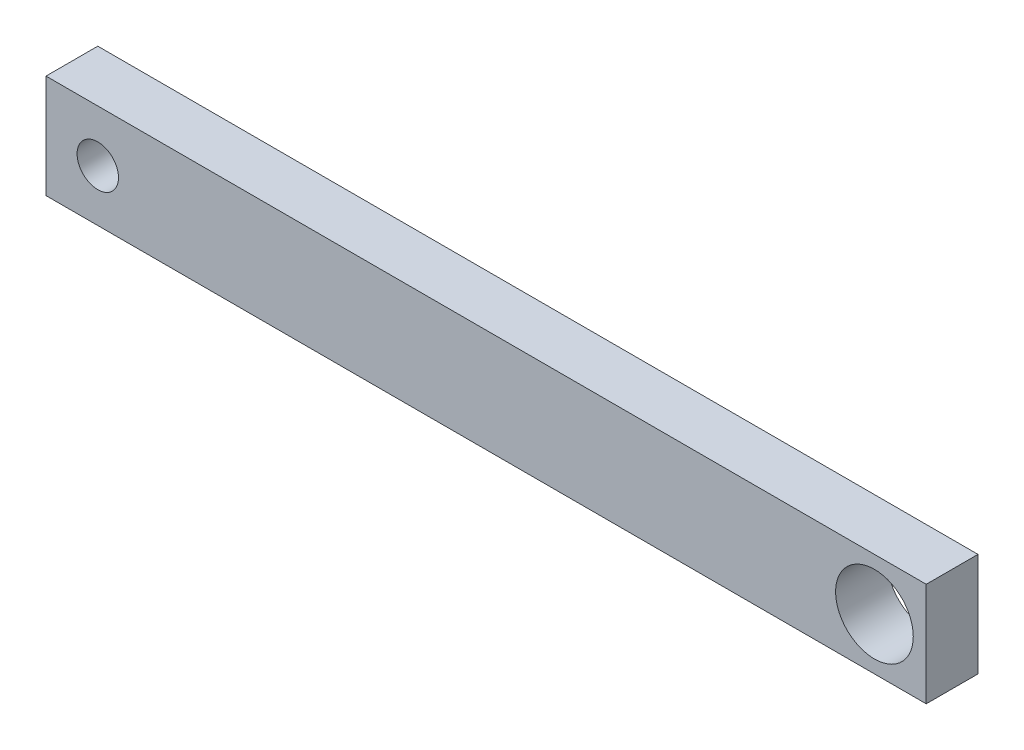
ISO-10303-21;
HEADER;
FILE_DESCRIPTION(('STEP AP214'),'2;1');
FILE_NAME('part.step','',(''),(''),'','','');
FILE_SCHEMA(('AUTOMOTIVE_DESIGN { 1 0 10303 214 1 1 1 1 }'));
ENDSEC;
DATA;
#1=APPLICATION_CONTEXT('core data for automotive mechanical design processes');
#2=APPLICATION_PROTOCOL_DEFINITION('international standard','automotive_design',2000,#1);
#3=PRODUCT_CONTEXT('',#1,'mechanical');
#4=PRODUCT('Part','Part','',(#3));
#5=PRODUCT_RELATED_PRODUCT_CATEGORY('part','',(#4));
#6=PRODUCT_DEFINITION_FORMATION('','',#4);
#7=PRODUCT_DEFINITION_CONTEXT('part definition',#1,'design');
#8=PRODUCT_DEFINITION('design','',#6,#7);
#9=PRODUCT_DEFINITION_SHAPE('','',#8);
#10=(LENGTH_UNIT() NAMED_UNIT(*) SI_UNIT(.MILLI.,.METRE.));
#11=(NAMED_UNIT(*) PLANE_ANGLE_UNIT() SI_UNIT($,.RADIAN.));
#12=(NAMED_UNIT(*) SI_UNIT($,.STERADIAN.) SOLID_ANGLE_UNIT());
#13=UNCERTAINTY_MEASURE_WITH_UNIT(LENGTH_MEASURE(1.E-05),#10,'distance_accuracy_value','');
#14=(GEOMETRIC_REPRESENTATION_CONTEXT(3) GLOBAL_UNCERTAINTY_ASSIGNED_CONTEXT((#13)) GLOBAL_UNIT_ASSIGNED_CONTEXT((#10,
#11,#12)) REPRESENTATION_CONTEXT('',''));
#15=CARTESIAN_POINT('',(0.,0.,0.));
#16=DIRECTION('',(0.,0.,1.));
#17=DIRECTION('',(1.,0.,0.));
#18=AXIS2_PLACEMENT_3D('',#15,#16,#17);
#19=CARTESIAN_POINT('',(0.,0.,10.));
#20=DIRECTION('',(0.,0.,1.));
#21=DIRECTION('',(1.,0.,0.));
#22=AXIS2_PLACEMENT_3D('',#19,#20,#21);
#23=PLANE('',#22);
#24=CARTESIAN_POINT('',(10.,-10.,10.));
#25=DIRECTION('',(0.,0.,1.));
#26=DIRECTION('',(1.,0.,0.));
#27=AXIS2_PLACEMENT_3D('',#24,#25,#26);
#28=CIRCLE('',#27,4.);
#29=CARTESIAN_POINT('',(14.,-10.,10.));
#30=VERTEX_POINT('',#29);
#31=EDGE_CURVE('E106',#30,#30,#28,.T.);
#32=ORIENTED_EDGE('',*,*,#31,.F.);
#33=EDGE_LOOP('',(#32));
#34=FACE_BOUND('',#33,.T.);
#35=DIRECTION('',(0.,-1.,0.));
#36=VECTOR('',#35,1.);
#37=CARTESIAN_POINT('',(0.,0.,10.));
#38=LINE('',#37,#36);
#39=CARTESIAN_POINT('',(0.,0.,10.));
#40=VERTEX_POINT('',#39);
#41=CARTESIAN_POINT('',(0.,-20.,10.));
#42=VERTEX_POINT('',#41);
#43=EDGE_CURVE('E91',#40,#42,#38,.T.);
#44=ORIENTED_EDGE('',*,*,#43,.T.);
#45=DIRECTION('',(1.,0.,0.));
#46=VECTOR('',#45,1.);
#47=CARTESIAN_POINT('',(0.,-20.,10.));
#48=LINE('',#47,#46);
#49=CARTESIAN_POINT('',(170.,-20.,10.));
#50=VERTEX_POINT('',#49);
#51=EDGE_CURVE('E86',#42,#50,#48,.T.);
#52=ORIENTED_EDGE('',*,*,#51,.T.);
#53=DIRECTION('',(0.,1.,0.));
#54=VECTOR('',#53,1.);
#55=CARTESIAN_POINT('',(170.,0.,10.));
#56=LINE('',#55,#54);
#57=CARTESIAN_POINT('',(170.,0.,10.));
#58=VERTEX_POINT('',#57);
#59=EDGE_CURVE('E89',#50,#58,#56,.T.);
#60=ORIENTED_EDGE('',*,*,#59,.T.);
#61=DIRECTION('',(-1.,0.,0.));
#62=VECTOR('',#61,1.);
#63=CARTESIAN_POINT('',(0.,0.,10.));
#64=LINE('',#63,#62);
#65=EDGE_CURVE('E56',#58,#40,#64,.T.);
#66=ORIENTED_EDGE('',*,*,#65,.T.);
#67=EDGE_LOOP('',(#44,#52,#60,#66));
#68=FACE_BOUND('',#67,.T.);
#69=CARTESIAN_POINT('',(160.,-10.,10.));
#70=DIRECTION('',(0.,0.,1.));
#71=DIRECTION('',(1.,0.,0.));
#72=AXIS2_PLACEMENT_3D('',#69,#70,#71);
#73=CIRCLE('',#72,7.50000000000001);
#74=CARTESIAN_POINT('',(167.5,-10.,10.));
#75=VERTEX_POINT('',#74);
#76=EDGE_CURVE('E121',#75,#75,#73,.T.);
#77=ORIENTED_EDGE('',*,*,#76,.F.);
#78=EDGE_LOOP('',(#77));
#79=FACE_BOUND('',#78,.T.);
#80=ADVANCED_FACE('F39',(#34,#68,#79),#23,.T.);
#81=CARTESIAN_POINT('',(0.,0.,0.));
#82=DIRECTION('',(0.,0.,1.));
#83=DIRECTION('',(1.,0.,0.));
#84=AXIS2_PLACEMENT_3D('',#81,#82,#83);
#85=PLANE('',#84);
#86=DIRECTION('',(0.,-1.,0.));
#87=VECTOR('',#86,1.);
#88=CARTESIAN_POINT('',(0.,0.,0.));
#89=LINE('',#88,#87);
#90=CARTESIAN_POINT('',(0.,0.,0.));
#91=VERTEX_POINT('',#90);
#92=CARTESIAN_POINT('',(0.,-20.,0.));
#93=VERTEX_POINT('',#92);
#94=EDGE_CURVE('E103',#91,#93,#89,.T.);
#95=ORIENTED_EDGE('',*,*,#94,.F.);
#96=DIRECTION('',(-1.,0.,0.));
#97=VECTOR('',#96,1.);
#98=CARTESIAN_POINT('',(0.,0.,0.));
#99=LINE('',#98,#97);
#100=CARTESIAN_POINT('',(170.,0.,0.));
#101=VERTEX_POINT('',#100);
#102=EDGE_CURVE('E79',#101,#91,#99,.T.);
#103=ORIENTED_EDGE('',*,*,#102,.F.);
#104=DIRECTION('',(0.,1.,0.));
#105=VECTOR('',#104,1.);
#106=CARTESIAN_POINT('',(170.,0.,0.));
#107=LINE('',#106,#105);
#108=CARTESIAN_POINT('',(170.,-20.,0.));
#109=VERTEX_POINT('',#108);
#110=EDGE_CURVE('E73',#109,#101,#107,.T.);
#111=ORIENTED_EDGE('',*,*,#110,.F.);
#112=DIRECTION('',(1.,0.,0.));
#113=VECTOR('',#112,1.);
#114=CARTESIAN_POINT('',(0.,-20.,0.));
#115=LINE('',#114,#113);
#116=EDGE_CURVE('E95',#93,#109,#115,.T.);
#117=ORIENTED_EDGE('',*,*,#116,.F.);
#118=EDGE_LOOP('',(#95,#103,#111,#117));
#119=FACE_BOUND('',#118,.T.);
#120=CARTESIAN_POINT('',(10.,-10.,0.));
#121=DIRECTION('',(0.,0.,1.));
#122=DIRECTION('',(1.,0.,0.));
#123=AXIS2_PLACEMENT_3D('',#120,#121,#122);
#124=CIRCLE('',#123,4.);
#125=CARTESIAN_POINT('',(14.,-10.,0.));
#126=VERTEX_POINT('',#125);
#127=EDGE_CURVE('E118',#126,#126,#124,.T.);
#128=ORIENTED_EDGE('',*,*,#127,.T.);
#129=EDGE_LOOP('',(#128));
#130=FACE_BOUND('',#129,.T.);
#131=CARTESIAN_POINT('',(160.,-10.,0.));
#132=DIRECTION('',(0.,0.,1.));
#133=DIRECTION('',(1.,0.,0.));
#134=AXIS2_PLACEMENT_3D('',#131,#132,#133);
#135=CIRCLE('',#134,7.50000000000001);
#136=CARTESIAN_POINT('',(167.5,-10.,0.));
#137=VERTEX_POINT('',#136);
#138=EDGE_CURVE('E124',#137,#137,#135,.T.);
#139=ORIENTED_EDGE('',*,*,#138,.T.);
#140=EDGE_LOOP('',(#139));
#141=FACE_BOUND('',#140,.T.);
#142=ADVANCED_FACE('F114',(#119,#130,#141),#85,.F.);
#143=CARTESIAN_POINT('',(0.,0.,10.));
#144=DIRECTION('',(1.,0.,0.));
#145=DIRECTION('',(0.,0.,-1.));
#146=AXIS2_PLACEMENT_3D('',#143,#144,#145);
#147=PLANE('',#146);
#148=ORIENTED_EDGE('',*,*,#94,.T.);
#149=DIRECTION('',(0.,0.,-1.));
#150=VECTOR('',#149,1.);
#151=CARTESIAN_POINT('',(0.,-20.,10.));
#152=LINE('',#151,#150);
#153=EDGE_CURVE('E11',#42,#93,#152,.T.);
#154=ORIENTED_EDGE('',*,*,#153,.F.);
#155=ORIENTED_EDGE('',*,*,#43,.F.);
#156=DIRECTION('',(0.,0.,-1.));
#157=VECTOR('',#156,1.);
#158=CARTESIAN_POINT('',(0.,0.,10.));
#159=LINE('',#158,#157);
#160=EDGE_CURVE('E99',#40,#91,#159,.T.);
#161=ORIENTED_EDGE('',*,*,#160,.T.);
#162=EDGE_LOOP('',(#148,#154,#155,#161));
#163=FACE_BOUND('',#162,.T.);
#164=ADVANCED_FACE('F41',(#163),#147,.F.);
#165=CARTESIAN_POINT('',(0.,-20.,10.));
#166=DIRECTION('',(0.,1.,0.));
#167=DIRECTION('',(-1.,0.,0.));
#168=AXIS2_PLACEMENT_3D('',#165,#166,#167);
#169=PLANE('',#168);
#170=ORIENTED_EDGE('',*,*,#116,.T.);
#171=DIRECTION('',(0.,0.,-1.));
#172=VECTOR('',#171,1.);
#173=CARTESIAN_POINT('',(170.,-20.,10.));
#174=LINE('',#173,#172);
#175=EDGE_CURVE('E48',#50,#109,#174,.T.);
#176=ORIENTED_EDGE('',*,*,#175,.F.);
#177=ORIENTED_EDGE('',*,*,#51,.F.);
#178=ORIENTED_EDGE('',*,*,#153,.T.);
#179=EDGE_LOOP('',(#170,#176,#177,#178));
#180=FACE_BOUND('',#179,.T.);
#181=ADVANCED_FACE('F94',(#180),#169,.F.);
#182=CARTESIAN_POINT('',(170.,0.,10.));
#183=DIRECTION('',(-1.,0.,0.));
#184=DIRECTION('',(0.,0.,1.));
#185=AXIS2_PLACEMENT_3D('',#182,#183,#184);
#186=PLANE('',#185);
#187=ORIENTED_EDGE('',*,*,#110,.T.);
#188=DIRECTION('',(0.,0.,-1.));
#189=VECTOR('',#188,1.);
#190=CARTESIAN_POINT('',(170.,0.,10.));
#191=LINE('',#190,#189);
#192=EDGE_CURVE('E96',#58,#101,#191,.T.);
#193=ORIENTED_EDGE('',*,*,#192,.F.);
#194=ORIENTED_EDGE('',*,*,#59,.F.);
#195=ORIENTED_EDGE('',*,*,#175,.T.);
#196=EDGE_LOOP('',(#187,#193,#194,#195));
#197=FACE_BOUND('',#196,.T.);
#198=ADVANCED_FACE('F97',(#197),#186,.F.);
#199=CARTESIAN_POINT('',(0.,0.,10.));
#200=DIRECTION('',(0.,-1.,0.));
#201=DIRECTION('',(0.,0.,-1.));
#202=AXIS2_PLACEMENT_3D('',#199,#200,#201);
#203=PLANE('',#202);
#204=ORIENTED_EDGE('',*,*,#102,.T.);
#205=ORIENTED_EDGE('',*,*,#160,.F.);
#206=ORIENTED_EDGE('',*,*,#65,.F.);
#207=ORIENTED_EDGE('',*,*,#192,.T.);
#208=EDGE_LOOP('',(#204,#205,#206,#207));
#209=FACE_BOUND('',#208,.T.);
#210=ADVANCED_FACE('F111',(#209),#203,.F.);
#211=CARTESIAN_POINT('',(10.,-10.,10.));
#212=DIRECTION('',(0.,0.,-1.));
#213=DIRECTION('',(-1.,0.,0.));
#214=AXIS2_PLACEMENT_3D('',#211,#212,#213);
#215=CYLINDRICAL_SURFACE('',#214,4.);
#216=ORIENTED_EDGE('',*,*,#31,.T.);
#217=EDGE_LOOP('',(#216));
#218=FACE_BOUND('',#217,.T.);
#219=ORIENTED_EDGE('',*,*,#127,.F.);
#220=EDGE_LOOP('',(#219));
#221=FACE_BOUND('',#220,.T.);
#222=ADVANCED_FACE('F141',(#218,#221),#215,.F.);
#223=CARTESIAN_POINT('',(160.,-10.,10.));
#224=DIRECTION('',(0.,0.,-1.));
#225=DIRECTION('',(-1.,0.,0.));
#226=AXIS2_PLACEMENT_3D('',#223,#224,#225);
#227=CYLINDRICAL_SURFACE('',#226,7.50000000000001);
#228=ORIENTED_EDGE('',*,*,#76,.T.);
#229=EDGE_LOOP('',(#228));
#230=FACE_BOUND('',#229,.T.);
#231=ORIENTED_EDGE('',*,*,#138,.F.);
#232=EDGE_LOOP('',(#231));
#233=FACE_BOUND('',#232,.T.);
#234=ADVANCED_FACE('F130',(#230,#233),#227,.F.);
#235=CLOSED_SHELL('',(#80,#142,#164,#181,#198,#210,#222,#234));
#236=MANIFOLD_SOLID_BREP('B2',#235);
#237=ADVANCED_BREP_SHAPE_REPRESENTATION('',(#18,#236),#14);
#238=SHAPE_DEFINITION_REPRESENTATION(#9,#237);
ENDSEC;
END-ISO-10303-21;
